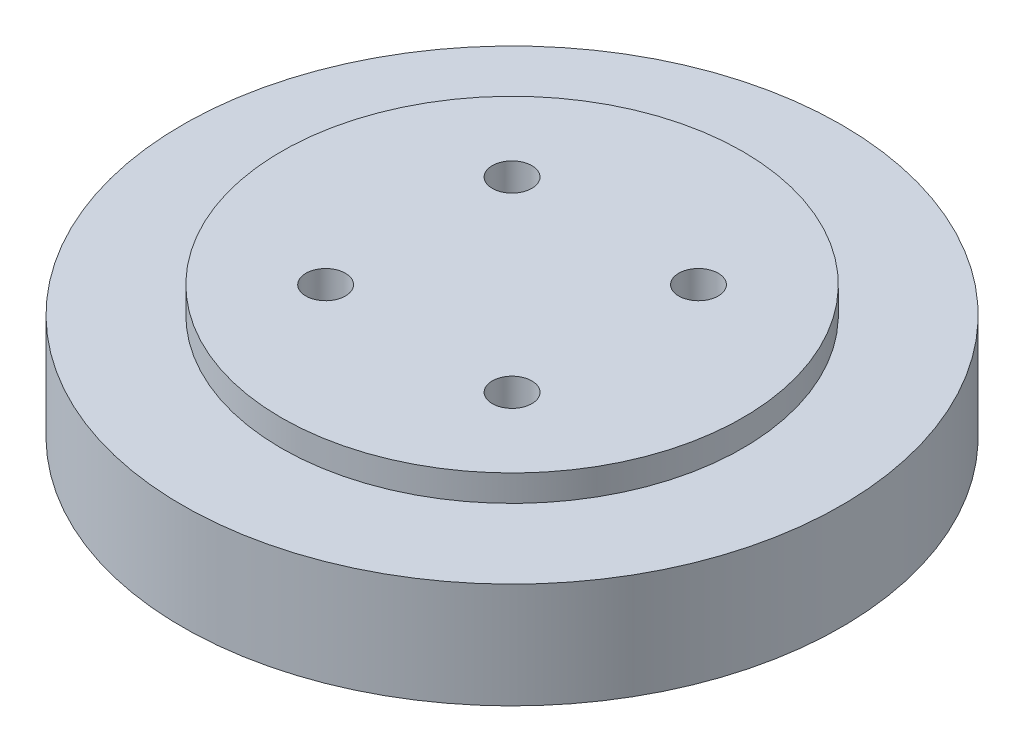
ISO-10303-21;
HEADER;
FILE_DESCRIPTION(('STEP AP214'),'2;1');
FILE_NAME('part.step','',(''),(''),'','','');
FILE_SCHEMA(('AUTOMOTIVE_DESIGN { 1 0 10303 214 1 1 1 1 }'));
ENDSEC;
DATA;
#1=APPLICATION_CONTEXT('core data for automotive mechanical design processes');
#2=APPLICATION_PROTOCOL_DEFINITION('international standard','automotive_design',2000,#1);
#3=PRODUCT_CONTEXT('',#1,'mechanical');
#4=PRODUCT('Part','Part','',(#3));
#5=PRODUCT_RELATED_PRODUCT_CATEGORY('part','',(#4));
#6=PRODUCT_DEFINITION_FORMATION('','',#4);
#7=PRODUCT_DEFINITION_CONTEXT('part definition',#1,'design');
#8=PRODUCT_DEFINITION('design','',#6,#7);
#9=PRODUCT_DEFINITION_SHAPE('','',#8);
#10=(LENGTH_UNIT() NAMED_UNIT(*) SI_UNIT(.MILLI.,.METRE.));
#11=(NAMED_UNIT(*) PLANE_ANGLE_UNIT() SI_UNIT($,.RADIAN.));
#12=(NAMED_UNIT(*) SI_UNIT($,.STERADIAN.) SOLID_ANGLE_UNIT());
#13=UNCERTAINTY_MEASURE_WITH_UNIT(LENGTH_MEASURE(1.E-05),#10,'distance_accuracy_value','');
#14=(GEOMETRIC_REPRESENTATION_CONTEXT(3) GLOBAL_UNCERTAINTY_ASSIGNED_CONTEXT((#13)) GLOBAL_UNIT_ASSIGNED_CONTEXT((#10,
#11,#12)) REPRESENTATION_CONTEXT('',''));
#15=CARTESIAN_POINT('',(0.,0.,0.));
#16=DIRECTION('',(0.,0.,1.));
#17=DIRECTION('',(1.,0.,0.));
#18=AXIS2_PLACEMENT_3D('',#15,#16,#17);
#19=CARTESIAN_POINT('',(0.,0.,0.));
#20=DIRECTION('',(0.,-1.,0.));
#21=DIRECTION('',(0.,0.,-1.));
#22=AXIS2_PLACEMENT_3D('',#19,#20,#21);
#23=CYLINDRICAL_SURFACE('',#22,7.);
#24=DIRECTION('',(0.,-1.,0.));
#25=VECTOR('',#24,1.);
#26=CARTESIAN_POINT('',(-5.36231110183288,10.149030895279,4.4995132678058));
#27=LINE('',#26,#25);
#28=CARTESIAN_POINT('',(-5.36231110183284,6.99999999999998,4.4995132678058));
#29=VERTEX_POINT('',#28);
#30=CARTESIAN_POINT('',(-5.36231110183283,0.,4.4995132678058));
#31=VERTEX_POINT('',#30);
#32=EDGE_CURVE('E349',#29,#31,#27,.T.);
#33=ORIENTED_EDGE('',*,*,#32,.T.);
#34=CARTESIAN_POINT('',(0.,0.,0.));
#35=DIRECTION('',(0.,-1.,0.));
#36=DIRECTION('',(0.,0.,-1.));
#37=AXIS2_PLACEMENT_3D('',#34,#35,#36);
#38=CIRCLE('',#37,7.);
#39=CARTESIAN_POINT('',(-1.21553724366839,0.,6.89365427108546));
#40=VERTEX_POINT('',#39);
#41=EDGE_CURVE('E11',#40,#31,#38,.T.);
#42=ORIENTED_EDGE('',*,*,#41,.F.);
#43=DIRECTION('',(0.,-1.,0.));
#44=VECTOR('',#43,1.);
#45=CARTESIAN_POINT('',(-1.21553724366841,9.66472120194616,6.89365427108546));
#46=LINE('',#45,#44);
#47=CARTESIAN_POINT('',(-1.21553724366841,6.99999999999998,6.89365427108546));
#48=VERTEX_POINT('',#47);
#49=EDGE_CURVE('E298',#48,#40,#46,.T.);
#50=ORIENTED_EDGE('',*,*,#49,.F.);
#51=CARTESIAN_POINT('',(0.,7.00000000000001,0.));
#52=DIRECTION('',(0.,-1.,0.));
#53=DIRECTION('',(0.,0.,-1.));
#54=AXIS2_PLACEMENT_3D('',#51,#52,#53);
#55=CIRCLE('',#54,7.);
#56=EDGE_CURVE('E229',#48,#29,#55,.T.);
#57=ORIENTED_EDGE('',*,*,#56,.T.);
#58=EDGE_LOOP('',(#33,#42,#50,#57));
#59=FACE_BOUND('',#58,.T.);
#60=ADVANCED_FACE('F38',(#59),#23,.T.);
#61=DIRECTION('',(0.,-1.,0.));
#62=VECTOR('',#61,1.);
#63=CARTESIAN_POINT('',(-6.57784834550138,10.149030895279,2.39414100327981));
#64=LINE('',#63,#62);
#65=CARTESIAN_POINT('',(-6.57784834550134,7.00000000000001,2.39414100327981));
#66=VERTEX_POINT('',#65);
#67=CARTESIAN_POINT('',(-6.57784834550133,0.,2.39414100327981));
#68=VERTEX_POINT('',#67);
#69=EDGE_CURVE('E342',#66,#68,#64,.T.);
#70=ORIENTED_EDGE('',*,*,#69,.F.);
#71=CARTESIAN_POINT('',(-6.57784834550131,7.00000000000001,-2.39414100327967));
#72=VERTEX_POINT('',#71);
#73=EDGE_CURVE('E235',#66,#72,#55,.T.);
#74=ORIENTED_EDGE('',*,*,#73,.T.);
#75=DIRECTION('',(0.,-1.,0.));
#76=VECTOR('',#75,1.);
#77=CARTESIAN_POINT('',(-6.57784834550136,10.149030895279,-2.39414100327967));
#78=LINE('',#77,#76);
#79=CARTESIAN_POINT('',(-6.57784834550129,0.,-2.39414100327967));
#80=VERTEX_POINT('',#79);
#81=EDGE_CURVE('E372',#72,#80,#78,.T.);
#82=ORIENTED_EDGE('',*,*,#81,.T.);
#83=EDGE_CURVE('E46',#68,#80,#38,.T.);
#84=ORIENTED_EDGE('',*,*,#83,.F.);
#85=EDGE_LOOP('',(#70,#74,#82,#84));
#86=FACE_BOUND('',#85,.T.);
#87=ADVANCED_FACE('F462',(#86),#23,.T.);
#88=DIRECTION('',(0.,-1.,0.));
#89=VECTOR('',#88,1.);
#90=CARTESIAN_POINT('',(-5.36231110183292,10.1490308952789,-4.49951326780569));
#91=LINE('',#90,#89);
#92=CARTESIAN_POINT('',(-5.36231110183286,6.99999999999998,-4.49951326780569));
#93=VERTEX_POINT('',#92);
#94=CARTESIAN_POINT('',(-5.3623111018329,0.,-4.49951326780569));
#95=VERTEX_POINT('',#94);
#96=EDGE_CURVE('E365',#93,#95,#91,.T.);
#97=ORIENTED_EDGE('',*,*,#96,.F.);
#98=CARTESIAN_POINT('',(-1.21553724366848,6.99999999999998,-6.89365427108547));
#99=VERTEX_POINT('',#98);
#100=EDGE_CURVE('E242',#93,#99,#55,.T.);
#101=ORIENTED_EDGE('',*,*,#100,.T.);
#102=DIRECTION('',(0.,-1.,0.));
#103=VECTOR('',#102,1.);
#104=CARTESIAN_POINT('',(-1.21553724366848,9.66472120194616,-6.89365427108546));
#105=LINE('',#104,#103);
#106=CARTESIAN_POINT('',(-1.21553724366846,0.,-6.89365427108546));
#107=VERTEX_POINT('',#106);
#108=EDGE_CURVE('E393',#99,#107,#105,.T.);
#109=ORIENTED_EDGE('',*,*,#108,.T.);
#110=EDGE_CURVE('E228',#95,#107,#38,.T.);
#111=ORIENTED_EDGE('',*,*,#110,.F.);
#112=EDGE_LOOP('',(#97,#101,#109,#111));
#113=FACE_BOUND('',#112,.T.);
#114=ADVANCED_FACE('F471',(#113),#23,.T.);
#115=DIRECTION('',(0.,-1.,0.));
#116=VECTOR('',#115,1.);
#117=CARTESIAN_POINT('',(1.21553724366846,9.66472120194617,-6.89365427108546));
#118=LINE('',#117,#116);
#119=CARTESIAN_POINT('',(1.21553724366845,7.00000000000001,-6.89365427108546));
#120=VERTEX_POINT('',#119);
#121=CARTESIAN_POINT('',(1.21553724366846,0.,-6.89365427108546));
#122=VERTEX_POINT('',#121);
#123=EDGE_CURVE('E386',#120,#122,#118,.T.);
#124=ORIENTED_EDGE('',*,*,#123,.F.);
#125=CARTESIAN_POINT('',(5.3623111018329,7.00000000000001,-4.49951326780576));
#126=VERTEX_POINT('',#125);
#127=EDGE_CURVE('E251',#120,#126,#55,.T.);
#128=ORIENTED_EDGE('',*,*,#127,.T.);
#129=DIRECTION('',(0.,-1.,0.));
#130=VECTOR('',#129,1.);
#131=CARTESIAN_POINT('',(5.36231110183286,10.149030895279,-4.49951326780576));
#132=LINE('',#131,#130);
#133=CARTESIAN_POINT('',(5.36231110183286,0.,-4.49951326780576));
#134=VERTEX_POINT('',#133);
#135=EDGE_CURVE('E62',#126,#134,#132,.T.);
#136=ORIENTED_EDGE('',*,*,#135,.T.);
#137=EDGE_CURVE('E226',#122,#134,#38,.T.);
#138=ORIENTED_EDGE('',*,*,#137,.F.);
#139=EDGE_LOOP('',(#124,#128,#136,#138));
#140=FACE_BOUND('',#139,.T.);
#141=ADVANCED_FACE('F490',(#140),#23,.T.);
#142=DIRECTION('',(0.,-1.,0.));
#143=VECTOR('',#142,1.);
#144=CARTESIAN_POINT('',(6.57784834550133,10.149030895279,-2.39414100327975));
#145=LINE('',#144,#143);
#146=CARTESIAN_POINT('',(6.57784834550138,6.99999999999998,-2.39414100327975));
#147=VERTEX_POINT('',#146);
#148=CARTESIAN_POINT('',(6.57784834550135,0.,-2.39414100327975));
#149=VERTEX_POINT('',#148);
#150=EDGE_CURVE('E200',#147,#149,#145,.T.);
#151=ORIENTED_EDGE('',*,*,#150,.F.);
#152=CARTESIAN_POINT('',(6.5778483455014,6.99999999999998,2.39414100327971));
#153=VERTEX_POINT('',#152);
#154=EDGE_CURVE('E244',#147,#153,#55,.T.);
#155=ORIENTED_EDGE('',*,*,#154,.T.);
#156=DIRECTION('',(0.,-1.,0.));
#157=VECTOR('',#156,1.);
#158=CARTESIAN_POINT('',(6.57784834550135,10.1490308952789,2.39414100327971));
#159=LINE('',#158,#157);
#160=CARTESIAN_POINT('',(6.57784834550135,0.,2.39414100327971));
#161=VERTEX_POINT('',#160);
#162=EDGE_CURVE('E54',#153,#161,#159,.T.);
#163=ORIENTED_EDGE('',*,*,#162,.T.);
#164=EDGE_CURVE('E219',#149,#161,#38,.T.);
#165=ORIENTED_EDGE('',*,*,#164,.F.);
#166=EDGE_LOOP('',(#151,#155,#163,#165));
#167=FACE_BOUND('',#166,.T.);
#168=ADVANCED_FACE('F225',(#167),#23,.T.);
#169=CARTESIAN_POINT('',(0.,0.,0.));
#170=DIRECTION('',(0.,-1.,0.));
#171=DIRECTION('',(0.,0.,-1.));
#172=AXIS2_PLACEMENT_3D('',#169,#170,#171);
#173=PLANE('',#172);
#174=DIRECTION('',(-0.766044443118975,0.,0.642787609686543));
#175=VECTOR('',#174,1.);
#176=CARTESIAN_POINT('',(-5.36231110183283,0.,4.4995132678058));
#177=LINE('',#176,#175);
#178=CARTESIAN_POINT('',(-4.59626665871385,0.,3.85672565811925));
#179=VERTEX_POINT('',#178);
#180=EDGE_CURVE('E345',#179,#31,#177,.T.);
#181=ORIENTED_EDGE('',*,*,#180,.F.);
#182=CARTESIAN_POINT('',(0.,0.,0.));
#183=DIRECTION('',(0.,1.,0.));
#184=DIRECTION('',(0.866025403784433,0.,-0.50000000000001));
#185=AXIS2_PLACEMENT_3D('',#182,#183,#184);
#186=CIRCLE('',#185,6.);
#187=CARTESIAN_POINT('',(-5.63815572471542,0.,2.05212085995409));
#188=VERTEX_POINT('',#187);
#189=EDGE_CURVE('E353',#188,#179,#186,.T.);
#190=ORIENTED_EDGE('',*,*,#189,.F.);
#191=DIRECTION('',(0.939692620785902,0.,-0.342020143325686));
#192=VECTOR('',#191,1.);
#193=CARTESIAN_POINT('',(-6.57784834550133,0.,2.39414100327981));
#194=LINE('',#193,#192);
#195=EDGE_CURVE('E356',#68,#188,#194,.T.);
#196=ORIENTED_EDGE('',*,*,#195,.F.);
#197=ORIENTED_EDGE('',*,*,#83,.T.);
#198=DIRECTION('',(-0.939692620785909,0.,-0.342020143325667));
#199=VECTOR('',#198,1.);
#200=CARTESIAN_POINT('',(-6.57784834550129,0.,-2.39414100327967));
#201=LINE('',#200,#199);
#202=CARTESIAN_POINT('',(-5.63815572471547,0.,-2.052120859954));
#203=VERTEX_POINT('',#202);
#204=EDGE_CURVE('E368',#203,#80,#201,.T.);
#205=ORIENTED_EDGE('',*,*,#204,.F.);
#206=CARTESIAN_POINT('',(0.,0.,0.));
#207=DIRECTION('',(0.,1.,0.));
#208=DIRECTION('',(0.866025403784443,0.,0.499999999999992));
#209=AXIS2_PLACEMENT_3D('',#206,#207,#208);
#210=CIRCLE('',#209,6.);
#211=CARTESIAN_POINT('',(-4.59626665871393,0.,-3.85672565811916));
#212=VERTEX_POINT('',#211);
#213=EDGE_CURVE('E377',#212,#203,#210,.T.);
#214=ORIENTED_EDGE('',*,*,#213,.F.);
#215=DIRECTION('',(0.766044443118989,0.,0.642787609686527));
#216=VECTOR('',#215,1.);
#217=CARTESIAN_POINT('',(-5.3623111018329,0.,-4.49951326780569));
#218=LINE('',#217,#216);
#219=EDGE_CURVE('E340',#95,#212,#218,.T.);
#220=ORIENTED_EDGE('',*,*,#219,.F.);
#221=ORIENTED_EDGE('',*,*,#110,.T.);
#222=DIRECTION('',(-0.173648177666923,0.,-0.984807753012209));
#223=VECTOR('',#222,1.);
#224=CARTESIAN_POINT('',(-1.21553724366846,0.,-6.89365427108546));
#225=LINE('',#224,#223);
#226=CARTESIAN_POINT('',(-1.04188906600156,0.,-5.90884651807326));
#227=VERTEX_POINT('',#226);
#228=EDGE_CURVE('E389',#227,#107,#225,.T.);
#229=ORIENTED_EDGE('',*,*,#228,.F.);
#230=CARTESIAN_POINT('',(0.,0.,0.));
#231=DIRECTION('',(0.,1.,0.));
#232=DIRECTION('',(0.,0.,1.));
#233=AXIS2_PLACEMENT_3D('',#230,#231,#232);
#234=CIRCLE('',#233,6.);
#235=CARTESIAN_POINT('',(1.04188906600152,0.,-5.90884651807326));
#236=VERTEX_POINT('',#235);
#237=EDGE_CURVE('E398',#236,#227,#234,.T.);
#238=ORIENTED_EDGE('',*,*,#237,.F.);
#239=DIRECTION('',(-0.173648177666923,0.,0.984807753012209));
#240=VECTOR('',#239,1.);
#241=CARTESIAN_POINT('',(1.21553724366846,0.,-6.89365427108546));
#242=LINE('',#241,#240);
#243=EDGE_CURVE('E363',#122,#236,#242,.T.);
#244=ORIENTED_EDGE('',*,*,#243,.F.);
#245=ORIENTED_EDGE('',*,*,#137,.T.);
#246=DIRECTION('',(0.76604444311898,0.,-0.642787609686538));
#247=VECTOR('',#246,1.);
#248=CARTESIAN_POINT('',(5.36231110183286,0.,-4.49951326780576));
#249=LINE('',#248,#247);
#250=CARTESIAN_POINT('',(4.59626665871387,0.,-3.85672565811923));
#251=VERTEX_POINT('',#250);
#252=EDGE_CURVE('E213',#251,#134,#249,.T.);
#253=ORIENTED_EDGE('',*,*,#252,.F.);
#254=CARTESIAN_POINT('',(0.,0.,0.));
#255=DIRECTION('',(0.,1.,0.));
#256=DIRECTION('',(-0.866025403784436,0.,0.500000000000004));
#257=AXIS2_PLACEMENT_3D('',#254,#255,#256);
#258=CIRCLE('',#257,6.);
#259=CARTESIAN_POINT('',(5.63815572471543,0.,-2.05212085995407));
#260=VERTEX_POINT('',#259);
#261=EDGE_CURVE('E222',#260,#251,#258,.T.);
#262=ORIENTED_EDGE('',*,*,#261,.F.);
#263=DIRECTION('',(-0.939692620785905,0.,0.34202014332568));
#264=VECTOR('',#263,1.);
#265=CARTESIAN_POINT('',(6.57784834550135,0.,-2.39414100327975));
#266=LINE('',#265,#264);
#267=EDGE_CURVE('E204',#149,#260,#266,.T.);
#268=ORIENTED_EDGE('',*,*,#267,.F.);
#269=ORIENTED_EDGE('',*,*,#164,.T.);
#270=DIRECTION('',(0.939692620785907,0.,0.342020143325673));
#271=VECTOR('',#270,1.);
#272=CARTESIAN_POINT('',(6.57784834550135,0.,2.39414100327971));
#273=LINE('',#272,#271);
#274=CARTESIAN_POINT('',(5.63815572471547,0.,2.05212085995404));
#275=VERTEX_POINT('',#274);
#276=EDGE_CURVE('E323',#275,#161,#273,.T.);
#277=ORIENTED_EDGE('',*,*,#276,.F.);
#278=CARTESIAN_POINT('',(0.,0.,0.));
#279=DIRECTION('',(0.,1.,0.));
#280=DIRECTION('',(-0.86602540378444,0.,-0.499999999999998));
#281=AXIS2_PLACEMENT_3D('',#278,#279,#280);
#282=CIRCLE('',#281,6.);
#283=CARTESIAN_POINT('',(4.5962666587139,0.,3.85672565811917));
#284=VERTEX_POINT('',#283);
#285=EDGE_CURVE('E330',#284,#275,#282,.T.);
#286=ORIENTED_EDGE('',*,*,#285,.F.);
#287=DIRECTION('',(-0.766044443118984,0.,-0.642787609686532));
#288=VECTOR('',#287,1.);
#289=CARTESIAN_POINT('',(5.36231110183288,0.,4.49951326780573));
#290=LINE('',#289,#288);
#291=CARTESIAN_POINT('',(5.36231110183288,0.,4.49951326780573));
#292=VERTEX_POINT('',#291);
#293=EDGE_CURVE('E333',#292,#284,#290,.T.);
#294=ORIENTED_EDGE('',*,*,#293,.F.);
#295=CARTESIAN_POINT('',(1.21553724366853,0.,6.89365427108546));
#296=VERTEX_POINT('',#295);
#297=EDGE_CURVE('E47',#292,#296,#38,.T.);
#298=ORIENTED_EDGE('',*,*,#297,.T.);
#299=DIRECTION('',(0.173648177666923,0.,0.984807753012209));
#300=VECTOR('',#299,1.);
#301=CARTESIAN_POINT('',(1.21553724366853,0.,6.89365427108546));
#302=LINE('',#301,#300);
#303=CARTESIAN_POINT('',(1.04188906600154,0.,5.90884651807326));
#304=VERTEX_POINT('',#303);
#305=EDGE_CURVE('E301',#304,#296,#302,.T.);
#306=ORIENTED_EDGE('',*,*,#305,.F.);
#307=CARTESIAN_POINT('',(0.,0.,0.));
#308=DIRECTION('',(0.,1.,0.));
#309=DIRECTION('',(0.,0.,-1.));
#310=AXIS2_PLACEMENT_3D('',#307,#308,#309);
#311=CIRCLE('',#310,6.);
#312=CARTESIAN_POINT('',(-1.04188906600154,0.,5.90884651807326));
#313=VERTEX_POINT('',#312);
#314=EDGE_CURVE('E309',#313,#304,#311,.T.);
#315=ORIENTED_EDGE('',*,*,#314,.F.);
#316=DIRECTION('',(0.173648177666923,0.,-0.984807753012209));
#317=VECTOR('',#316,1.);
#318=CARTESIAN_POINT('',(-1.21553724366839,0.,6.89365427108546));
#319=LINE('',#318,#317);
#320=EDGE_CURVE('E312',#40,#313,#319,.T.);
#321=ORIENTED_EDGE('',*,*,#320,.F.);
#322=ORIENTED_EDGE('',*,*,#41,.T.);
#323=EDGE_LOOP('',(#181,#190,#196,#197,#205,#214,#220,#221,#229,#238,#244,#245,#253,#262,#268,
#269,#277,#286,#294,#298,#306,#315,#321,#322));
#324=FACE_BOUND('',#323,.T.);
#325=ADVANCED_FACE('F40',(#324),#173,.T.);
#326=DIRECTION('',(0.,-1.,0.));
#327=VECTOR('',#326,1.);
#328=CARTESIAN_POINT('',(5.36231110183282,10.149030895279,4.49951326780573));
#329=LINE('',#328,#327);
#330=CARTESIAN_POINT('',(5.36231110183288,7.00000000000001,4.49951326780573));
#331=VERTEX_POINT('',#330);
#332=EDGE_CURVE('E320',#331,#292,#329,.T.);
#333=ORIENTED_EDGE('',*,*,#332,.F.);
#334=CARTESIAN_POINT('',(1.21553724366853,7.00000000000001,6.89365427108546));
#335=VERTEX_POINT('',#334);
#336=EDGE_CURVE('E236',#331,#335,#55,.T.);
#337=ORIENTED_EDGE('',*,*,#336,.T.);
#338=DIRECTION('',(0.,-1.,0.));
#339=VECTOR('',#338,1.);
#340=CARTESIAN_POINT('',(1.21553724366853,9.66472120194617,6.89365427108546));
#341=LINE('',#340,#339);
#342=EDGE_CURVE('E305',#335,#296,#341,.T.);
#343=ORIENTED_EDGE('',*,*,#342,.T.);
#344=ORIENTED_EDGE('',*,*,#297,.F.);
#345=EDGE_LOOP('',(#333,#337,#343,#344));
#346=FACE_BOUND('',#345,.T.);
#347=ADVANCED_FACE('F430',(#346),#23,.T.);
#348=CARTESIAN_POINT('',(6.99999999999999,7.,0.));
#349=DIRECTION('',(0.,-1.,0.));
#350=DIRECTION('',(0.,0.,-1.));
#351=AXIS2_PLACEMENT_3D('',#348,#349,#350);
#352=PLANE('',#351);
#353=CARTESIAN_POINT('',(-7.07106781186542,7.00000000000001,7.07106781186555));
#354=DIRECTION('',(0.,-1.,0.));
#355=DIRECTION('',(0.,0.,-1.));
#356=AXIS2_PLACEMENT_3D('',#353,#354,#355);
#357=CIRCLE('',#356,1.5);
#358=CARTESIAN_POINT('',(-7.07106781186542,7.00000000000001,5.57106781186555));
#359=VERTEX_POINT('',#358);
#360=EDGE_CURVE('E277',#359,#359,#357,.T.);
#361=ORIENTED_EDGE('',*,*,#360,.F.);
#362=EDGE_LOOP('',(#361));
#363=FACE_BOUND('',#362,.T.);
#364=CARTESIAN_POINT('',(7.0710678118655,7.,7.07106781186544));
#365=DIRECTION('',(0.,-1.,0.));
#366=DIRECTION('',(0.,0.,-1.));
#367=AXIS2_PLACEMENT_3D('',#364,#365,#366);
#368=CIRCLE('',#367,1.5);
#369=CARTESIAN_POINT('',(7.0710678118655,7.,5.57106781186544));
#370=VERTEX_POINT('',#369);
#371=EDGE_CURVE('E280',#370,#370,#368,.T.);
#372=ORIENTED_EDGE('',*,*,#371,.F.);
#373=EDGE_LOOP('',(#372));
#374=FACE_BOUND('',#373,.T.);
#375=CARTESIAN_POINT('',(7.07106781186535,7.,-7.07106781186559));
#376=DIRECTION('',(0.,-1.,0.));
#377=DIRECTION('',(0.,0.,-1.));
#378=AXIS2_PLACEMENT_3D('',#375,#376,#377);
#379=CIRCLE('',#378,1.5);
#380=CARTESIAN_POINT('',(7.07106781186535,7.,-8.57106781186559));
#381=VERTEX_POINT('',#380);
#382=EDGE_CURVE('E283',#381,#381,#379,.T.);
#383=ORIENTED_EDGE('',*,*,#382,.F.);
#384=EDGE_LOOP('',(#383));
#385=FACE_BOUND('',#384,.T.);
#386=CARTESIAN_POINT('',(-7.07106781186553,7.00000000000001,-7.07106781186544));
#387=DIRECTION('',(0.,-1.,0.));
#388=DIRECTION('',(0.,0.,-1.));
#389=AXIS2_PLACEMENT_3D('',#386,#387,#388);
#390=CIRCLE('',#389,1.5);
#391=CARTESIAN_POINT('',(-7.07106781186553,7.00000000000001,-8.57106781186544));
#392=VERTEX_POINT('',#391);
#393=EDGE_CURVE('E271',#392,#392,#390,.T.);
#394=ORIENTED_EDGE('',*,*,#393,.F.);
#395=EDGE_LOOP('',(#394));
#396=FACE_BOUND('',#395,.T.);
#397=CARTESIAN_POINT('',(0.,7.00000000000001,0.));
#398=DIRECTION('',(0.,-1.,0.));
#399=DIRECTION('',(0.,0.,-1.));
#400=AXIS2_PLACEMENT_3D('',#397,#398,#399);
#401=CIRCLE('',#400,24.);
#402=CARTESIAN_POINT('',(0.,7.00000000000001,-24.));
#403=VERTEX_POINT('',#402);
#404=EDGE_CURVE('E245',#403,#403,#401,.T.);
#405=ORIENTED_EDGE('',*,*,#404,.T.);
#406=EDGE_LOOP('',(#405));
#407=FACE_BOUND('',#406,.T.);
#408=ORIENTED_EDGE('',*,*,#56,.F.);
#409=DIRECTION('',(-0.173648177666923,0.,0.984807753012209));
#410=VECTOR('',#409,1.);
#411=CARTESIAN_POINT('',(-1.21553724366841,6.99999999999998,6.89365427108546));
#412=LINE('',#411,#410);
#413=CARTESIAN_POINT('',(-1.04188906600156,7.,5.90884651807326));
#414=VERTEX_POINT('',#413);
#415=EDGE_CURVE('E291',#414,#48,#412,.T.);
#416=ORIENTED_EDGE('',*,*,#415,.F.);
#417=CARTESIAN_POINT('',(0.,7.00000000000001,0.));
#418=DIRECTION('',(0.,-1.,0.));
#419=DIRECTION('',(0.,0.,-1.));
#420=AXIS2_PLACEMENT_3D('',#417,#418,#419);
#421=CIRCLE('',#420,6.);
#422=CARTESIAN_POINT('',(1.04188906600153,7.00000000000001,5.90884651807326));
#423=VERTEX_POINT('',#422);
#424=EDGE_CURVE('E307',#423,#414,#421,.T.);
#425=ORIENTED_EDGE('',*,*,#424,.F.);
#426=DIRECTION('',(-0.173648177666923,0.,-0.984807753012209));
#427=VECTOR('',#426,1.);
#428=CARTESIAN_POINT('',(1.21553724366852,7.00000000000001,6.89365427108546));
#429=LINE('',#428,#427);
#430=EDGE_CURVE('E297',#335,#423,#429,.T.);
#431=ORIENTED_EDGE('',*,*,#430,.F.);
#432=ORIENTED_EDGE('',*,*,#336,.F.);
#433=DIRECTION('',(0.766044443118984,0.,0.642787609686532));
#434=VECTOR('',#433,1.);
#435=CARTESIAN_POINT('',(5.36231110183288,7.00000000000001,4.49951326780573));
#436=LINE('',#435,#434);
#437=CARTESIAN_POINT('',(4.59626665871388,6.99999999999998,3.85672565811919));
#438=VERTEX_POINT('',#437);
#439=EDGE_CURVE('E315',#438,#331,#436,.T.);
#440=ORIENTED_EDGE('',*,*,#439,.F.);
#441=CARTESIAN_POINT('',(0.,7.00000000000001,0.));
#442=DIRECTION('',(0.,-1.,0.));
#443=DIRECTION('',(0.,0.,-1.));
#444=AXIS2_PLACEMENT_3D('',#441,#442,#443);
#445=CIRCLE('',#444,6.);
#446=CARTESIAN_POINT('',(5.63815572471549,7.00000000000001,2.05212085995404));
#447=VERTEX_POINT('',#446);
#448=EDGE_CURVE('E328',#447,#438,#445,.T.);
#449=ORIENTED_EDGE('',*,*,#448,.F.);
#450=DIRECTION('',(-0.939692620785907,0.,-0.342020143325673));
#451=VECTOR('',#450,1.);
#452=CARTESIAN_POINT('',(6.5778483455014,6.99999999999998,2.39414100327971));
#453=LINE('',#452,#451);
#454=EDGE_CURVE('E319',#153,#447,#453,.T.);
#455=ORIENTED_EDGE('',*,*,#454,.F.);
#456=ORIENTED_EDGE('',*,*,#154,.F.);
#457=DIRECTION('',(0.939692620785904,0.,-0.34202014332568));
#458=VECTOR('',#457,1.);
#459=CARTESIAN_POINT('',(6.57784834550138,6.99999999999998,-2.39414100327975));
#460=LINE('',#459,#458);
#461=CARTESIAN_POINT('',(5.63815572471541,7.00000000000001,-2.05212085995407));
#462=VERTEX_POINT('',#461);
#463=EDGE_CURVE('E207',#462,#147,#460,.T.);
#464=ORIENTED_EDGE('',*,*,#463,.F.);
#465=CARTESIAN_POINT('',(0.,7.00000000000001,0.));
#466=DIRECTION('',(0.,-1.,0.));
#467=DIRECTION('',(0.,0.,-1.));
#468=AXIS2_PLACEMENT_3D('',#465,#466,#467);
#469=CIRCLE('',#468,6.);
#470=CARTESIAN_POINT('',(4.59626665871386,6.99999999999998,-3.85672565811923));
#471=VERTEX_POINT('',#470);
#472=EDGE_CURVE('E411',#471,#462,#469,.T.);
#473=ORIENTED_EDGE('',*,*,#472,.F.);
#474=DIRECTION('',(-0.76604444311898,0.,0.642787609686537));
#475=VECTOR('',#474,1.);
#476=CARTESIAN_POINT('',(5.3623111018329,7.00000000000001,-4.49951326780576));
#477=LINE('',#476,#475);
#478=EDGE_CURVE('E405',#126,#471,#477,.T.);
#479=ORIENTED_EDGE('',*,*,#478,.F.);
#480=ORIENTED_EDGE('',*,*,#127,.F.);
#481=DIRECTION('',(0.173648177666923,0.,-0.984807753012209));
#482=VECTOR('',#481,1.);
#483=CARTESIAN_POINT('',(1.21553724366845,7.00000000000001,-6.89365427108546));
#484=LINE('',#483,#482);
#485=CARTESIAN_POINT('',(1.04188906600152,7.00000000000001,-5.90884651807326));
#486=VERTEX_POINT('',#485);
#487=EDGE_CURVE('E223',#486,#120,#484,.T.);
#488=ORIENTED_EDGE('',*,*,#487,.F.);
#489=CARTESIAN_POINT('',(0.,7.00000000000001,0.));
#490=DIRECTION('',(0.,-1.,0.));
#491=DIRECTION('',(0.,0.,-1.));
#492=AXIS2_PLACEMENT_3D('',#489,#490,#491);
#493=CIRCLE('',#492,6.);
#494=CARTESIAN_POINT('',(-1.04188906600156,7.,-5.90884651807326));
#495=VERTEX_POINT('',#494);
#496=EDGE_CURVE('E396',#495,#486,#493,.T.);
#497=ORIENTED_EDGE('',*,*,#496,.F.);
#498=DIRECTION('',(0.173648177666923,0.,0.984807753012209));
#499=VECTOR('',#498,1.);
#500=CARTESIAN_POINT('',(-1.21553724366848,6.99999999999998,-6.89365427108546));
#501=LINE('',#500,#499);
#502=EDGE_CURVE('E385',#99,#495,#501,.T.);
#503=ORIENTED_EDGE('',*,*,#502,.F.);
#504=ORIENTED_EDGE('',*,*,#100,.F.);
#505=DIRECTION('',(-0.766044443118989,0.,-0.642787609686527));
#506=VECTOR('',#505,1.);
#507=CARTESIAN_POINT('',(-5.36231110183286,6.99999999999998,-4.49951326780569));
#508=LINE('',#507,#506);
#509=CARTESIAN_POINT('',(-4.59626665871395,7.00000000000001,-3.85672565811916));
#510=VERTEX_POINT('',#509);
#511=EDGE_CURVE('E361',#510,#93,#508,.T.);
#512=ORIENTED_EDGE('',*,*,#511,.F.);
#513=CARTESIAN_POINT('',(0.,7.00000000000001,0.));
#514=DIRECTION('',(0.,-1.,0.));
#515=DIRECTION('',(0.,0.,-1.));
#516=AXIS2_PLACEMENT_3D('',#513,#514,#515);
#517=CIRCLE('',#516,6.);
#518=CARTESIAN_POINT('',(-5.63815572471548,7.00000000000001,-2.052120859954));
#519=VERTEX_POINT('',#518);
#520=EDGE_CURVE('E375',#519,#510,#517,.T.);
#521=ORIENTED_EDGE('',*,*,#520,.F.);
#522=DIRECTION('',(0.939692620785909,0.,0.342020143325667));
#523=VECTOR('',#522,1.);
#524=CARTESIAN_POINT('',(-6.57784834550131,7.00000000000001,-2.39414100327967));
#525=LINE('',#524,#523);
#526=EDGE_CURVE('E364',#72,#519,#525,.T.);
#527=ORIENTED_EDGE('',*,*,#526,.F.);
#528=ORIENTED_EDGE('',*,*,#73,.F.);
#529=DIRECTION('',(-0.939692620785902,0.,0.342020143325686));
#530=VECTOR('',#529,1.);
#531=CARTESIAN_POINT('',(-6.57784834550134,7.00000000000001,2.39414100327981));
#532=LINE('',#531,#530);
#533=CARTESIAN_POINT('',(-5.63815572471542,7.00000000000001,2.05212085995411));
#534=VERTEX_POINT('',#533);
#535=EDGE_CURVE('E338',#534,#66,#532,.T.);
#536=ORIENTED_EDGE('',*,*,#535,.F.);
#537=CARTESIAN_POINT('',(0.,7.00000000000001,0.));
#538=DIRECTION('',(0.,-1.,0.));
#539=DIRECTION('',(0.,0.,-1.));
#540=AXIS2_PLACEMENT_3D('',#537,#538,#539);
#541=CIRCLE('',#540,6.);
#542=CARTESIAN_POINT('',(-4.59626665871386,7.00000000000001,3.85672565811926));
#543=VERTEX_POINT('',#542);
#544=EDGE_CURVE('E351',#543,#534,#541,.T.);
#545=ORIENTED_EDGE('',*,*,#544,.F.);
#546=DIRECTION('',(0.766044443118975,0.,-0.642787609686543));
#547=VECTOR('',#546,1.);
#548=CARTESIAN_POINT('',(-5.36231110183284,6.99999999999998,4.4995132678058));
#549=LINE('',#548,#547);
#550=EDGE_CURVE('E341',#29,#543,#549,.T.);
#551=ORIENTED_EDGE('',*,*,#550,.F.);
#552=EDGE_LOOP('',(#408,#416,#425,#431,#432,#440,#449,#455,#456,#464,#473,#479,#480,#488,#497,
#503,#504,#512,#521,#527,#528,#536,#545,#551));
#553=FACE_BOUND('',#552,.T.);
#554=ADVANCED_FACE('F420',(#363,#374,#385,#396,#407,#553),#352,.T.);
#555=CARTESIAN_POINT('',(0.,0.,0.));
#556=DIRECTION('',(0.,-1.,0.));
#557=DIRECTION('',(0.,0.,-1.));
#558=AXIS2_PLACEMENT_3D('',#555,#556,#557);
#559=CYLINDRICAL_SURFACE('',#558,24.);
#560=CARTESIAN_POINT('',(0.,0.,0.));
#561=DIRECTION('',(0.,-1.,0.));
#562=DIRECTION('',(0.,0.,-1.));
#563=AXIS2_PLACEMENT_3D('',#560,#561,#562);
#564=CIRCLE('',#563,24.);
#565=CARTESIAN_POINT('',(0.,0.,-24.));
#566=VERTEX_POINT('',#565);
#567=EDGE_CURVE('E253',#566,#566,#564,.T.);
#568=ORIENTED_EDGE('',*,*,#567,.T.);
#569=EDGE_LOOP('',(#568));
#570=FACE_BOUND('',#569,.T.);
#571=ORIENTED_EDGE('',*,*,#404,.F.);
#572=EDGE_LOOP('',(#571));
#573=FACE_BOUND('',#572,.T.);
#574=ADVANCED_FACE('F512',(#570,#573),#559,.F.);
#575=CARTESIAN_POINT('',(24.,0.,0.));
#576=DIRECTION('',(0.,-1.,0.));
#577=DIRECTION('',(0.,0.,-1.));
#578=AXIS2_PLACEMENT_3D('',#575,#576,#577);
#579=PLANE('',#578);
#580=CARTESIAN_POINT('',(0.,0.,0.));
#581=DIRECTION('',(0.,-1.,0.));
#582=DIRECTION('',(0.,0.,-1.));
#583=AXIS2_PLACEMENT_3D('',#580,#581,#582);
#584=CIRCLE('',#583,25.);
#585=CARTESIAN_POINT('',(0.,0.,-25.));
#586=VERTEX_POINT('',#585);
#587=EDGE_CURVE('E257',#586,#586,#584,.T.);
#588=ORIENTED_EDGE('',*,*,#587,.T.);
#589=EDGE_LOOP('',(#588));
#590=FACE_BOUND('',#589,.T.);
#591=ORIENTED_EDGE('',*,*,#567,.F.);
#592=EDGE_LOOP('',(#591));
#593=FACE_BOUND('',#592,.T.);
#594=ADVANCED_FACE('F716',(#590,#593),#579,.T.);
#595=CARTESIAN_POINT('',(0.,0.,0.));
#596=DIRECTION('',(0.,-1.,0.));
#597=DIRECTION('',(0.,0.,-1.));
#598=AXIS2_PLACEMENT_3D('',#595,#596,#597);
#599=CYLINDRICAL_SURFACE('',#598,25.);
#600=CARTESIAN_POINT('',(0.,8.00000000000001,0.));
#601=DIRECTION('',(0.,-1.,0.));
#602=DIRECTION('',(0.,0.,-1.));
#603=AXIS2_PLACEMENT_3D('',#600,#601,#602);
#604=CIRCLE('',#603,25.);
#605=CARTESIAN_POINT('',(0.,8.00000000000001,-25.));
#606=VERTEX_POINT('',#605);
#607=EDGE_CURVE('E262',#606,#606,#604,.T.);
#608=ORIENTED_EDGE('',*,*,#607,.T.);
#609=EDGE_LOOP('',(#608));
#610=FACE_BOUND('',#609,.T.);
#611=ORIENTED_EDGE('',*,*,#587,.F.);
#612=EDGE_LOOP('',(#611));
#613=FACE_BOUND('',#612,.T.);
#614=ADVANCED_FACE('F712',(#610,#613),#599,.T.);
#615=CARTESIAN_POINT('',(25.,8.00000000000001,0.));
#616=DIRECTION('',(0.,1.,0.));
#617=DIRECTION('',(0.,0.,1.));
#618=AXIS2_PLACEMENT_3D('',#615,#616,#617);
#619=PLANE('',#618);
#620=CARTESIAN_POINT('',(0.,8.00000000000001,0.));
#621=DIRECTION('',(0.,-1.,0.));
#622=DIRECTION('',(0.,0.,-1.));
#623=AXIS2_PLACEMENT_3D('',#620,#621,#622);
#624=CIRCLE('',#623,17.5);
#625=CARTESIAN_POINT('',(0.,8.00000000000001,-17.5));
#626=VERTEX_POINT('',#625);
#627=EDGE_CURVE('E265',#626,#626,#624,.T.);
#628=ORIENTED_EDGE('',*,*,#627,.T.);
#629=EDGE_LOOP('',(#628));
#630=FACE_BOUND('',#629,.T.);
#631=ORIENTED_EDGE('',*,*,#607,.F.);
#632=EDGE_LOOP('',(#631));
#633=FACE_BOUND('',#632,.T.);
#634=ADVANCED_FACE('F708',(#630,#633),#619,.T.);
#635=CARTESIAN_POINT('',(0.,0.,0.));
#636=DIRECTION('',(0.,-1.,0.));
#637=DIRECTION('',(0.,0.,-1.));
#638=AXIS2_PLACEMENT_3D('',#635,#636,#637);
#639=CYLINDRICAL_SURFACE('',#638,17.5);
#640=CARTESIAN_POINT('',(0.,10.,0.));
#641=DIRECTION('',(0.,-1.,0.));
#642=DIRECTION('',(0.,0.,-1.));
#643=AXIS2_PLACEMENT_3D('',#640,#641,#642);
#644=CIRCLE('',#643,17.5);
#645=CARTESIAN_POINT('',(0.,10.,-17.5));
#646=VERTEX_POINT('',#645);
#647=EDGE_CURVE('E268',#646,#646,#644,.T.);
#648=ORIENTED_EDGE('',*,*,#647,.T.);
#649=EDGE_LOOP('',(#648));
#650=FACE_BOUND('',#649,.T.);
#651=ORIENTED_EDGE('',*,*,#627,.F.);
#652=EDGE_LOOP('',(#651));
#653=FACE_BOUND('',#652,.T.);
#654=ADVANCED_FACE('F704',(#650,#653),#639,.T.);
#655=CARTESIAN_POINT('',(17.5,10.,0.));
#656=DIRECTION('',(0.,1.,0.));
#657=DIRECTION('',(0.,0.,1.));
#658=AXIS2_PLACEMENT_3D('',#655,#656,#657);
#659=PLANE('',#658);
#660=CARTESIAN_POINT('',(-7.07106781186542,10.,7.07106781186555));
#661=DIRECTION('',(0.,1.,0.));
#662=DIRECTION('',(1.,0.,0.));
#663=AXIS2_PLACEMENT_3D('',#660,#661,#662);
#664=CIRCLE('',#663,1.5);
#665=CARTESIAN_POINT('',(-5.57106781186542,10.,7.07106781186555));
#666=VERTEX_POINT('',#665);
#667=EDGE_CURVE('E286',#666,#666,#664,.T.);
#668=ORIENTED_EDGE('',*,*,#667,.F.);
#669=EDGE_LOOP('',(#668));
#670=FACE_BOUND('',#669,.T.);
#671=CARTESIAN_POINT('',(7.07106781186544,10.,7.07106781186544));
#672=DIRECTION('',(0.,1.,0.));
#673=DIRECTION('',(0.,0.,-1.));
#674=AXIS2_PLACEMENT_3D('',#671,#672,#673);
#675=CIRCLE('',#674,1.5);
#676=CARTESIAN_POINT('',(7.07106781186544,10.,5.57106781186543));
#677=VERTEX_POINT('',#676);
#678=EDGE_CURVE('E290',#677,#677,#675,.T.);
#679=ORIENTED_EDGE('',*,*,#678,.F.);
#680=EDGE_LOOP('',(#679));
#681=FACE_BOUND('',#680,.T.);
#682=CARTESIAN_POINT('',(7.07106781186529,10.,-7.07106781186559));
#683=DIRECTION('',(0.,1.,0.));
#684=DIRECTION('',(-1.,0.,0.));
#685=AXIS2_PLACEMENT_3D('',#682,#683,#684);
#686=CIRCLE('',#685,1.5);
#687=CARTESIAN_POINT('',(5.57106781186529,10.,-7.07106781186557));
#688=VERTEX_POINT('',#687);
#689=EDGE_CURVE('E287',#688,#688,#686,.T.);
#690=ORIENTED_EDGE('',*,*,#689,.F.);
#691=EDGE_LOOP('',(#690));
#692=FACE_BOUND('',#691,.T.);
#693=CARTESIAN_POINT('',(-7.07106781186553,10.,-7.07106781186544));
#694=DIRECTION('',(0.,1.,0.));
#695=DIRECTION('',(0.,0.,1.));
#696=AXIS2_PLACEMENT_3D('',#693,#694,#695);
#697=CIRCLE('',#696,1.5);
#698=CARTESIAN_POINT('',(-7.07106781186553,10.,-5.57106781186543));
#699=VERTEX_POINT('',#698);
#700=EDGE_CURVE('E274',#699,#699,#697,.T.);
#701=ORIENTED_EDGE('',*,*,#700,.F.);
#702=EDGE_LOOP('',(#701));
#703=FACE_BOUND('',#702,.T.);
#704=ORIENTED_EDGE('',*,*,#647,.F.);
#705=EDGE_LOOP('',(#704));
#706=FACE_BOUND('',#705,.T.);
#707=ADVANCED_FACE('F700',(#670,#681,#692,#703,#706),#659,.T.);
#708=CARTESIAN_POINT('',(-7.07106781186552,0.,-7.07106781186544));
#709=DIRECTION('',(0.,1.,0.));
#710=DIRECTION('',(0.,0.,1.));
#711=AXIS2_PLACEMENT_3D('',#708,#709,#710);
#712=CYLINDRICAL_SURFACE('',#711,1.5);
#713=ORIENTED_EDGE('',*,*,#393,.T.);
#714=EDGE_LOOP('',(#713));
#715=FACE_BOUND('',#714,.T.);
#716=ORIENTED_EDGE('',*,*,#700,.T.);
#717=EDGE_LOOP('',(#716));
#718=FACE_BOUND('',#717,.T.);
#719=ADVANCED_FACE('F696',(#715,#718),#712,.F.);
#720=CARTESIAN_POINT('',(7.07106781186536,0.,-7.07106781186559));
#721=DIRECTION('',(0.,1.,0.));
#722=DIRECTION('',(0.,0.,1.));
#723=AXIS2_PLACEMENT_3D('',#720,#721,#722);
#724=CYLINDRICAL_SURFACE('',#723,1.5);
#725=ORIENTED_EDGE('',*,*,#382,.T.);
#726=EDGE_LOOP('',(#725));
#727=FACE_BOUND('',#726,.T.);
#728=ORIENTED_EDGE('',*,*,#689,.T.);
#729=EDGE_LOOP('',(#728));
#730=FACE_BOUND('',#729,.T.);
#731=ADVANCED_FACE('F692',(#727,#730),#724,.F.);
#732=CARTESIAN_POINT('',(7.0710678118655,0.,7.07106781186544));
#733=DIRECTION('',(0.,1.,0.));
#734=DIRECTION('',(0.,0.,1.));
#735=AXIS2_PLACEMENT_3D('',#732,#733,#734);
#736=CYLINDRICAL_SURFACE('',#735,1.5);
#737=ORIENTED_EDGE('',*,*,#371,.T.);
#738=EDGE_LOOP('',(#737));
#739=FACE_BOUND('',#738,.T.);
#740=ORIENTED_EDGE('',*,*,#678,.T.);
#741=EDGE_LOOP('',(#740));
#742=FACE_BOUND('',#741,.T.);
#743=ADVANCED_FACE('F688',(#739,#742),#736,.F.);
#744=CARTESIAN_POINT('',(-7.07106781186541,0.,7.07106781186555));
#745=DIRECTION('',(0.,1.,0.));
#746=DIRECTION('',(0.,0.,1.));
#747=AXIS2_PLACEMENT_3D('',#744,#745,#746);
#748=CYLINDRICAL_SURFACE('',#747,1.5);
#749=ORIENTED_EDGE('',*,*,#360,.T.);
#750=EDGE_LOOP('',(#749));
#751=FACE_BOUND('',#750,.T.);
#752=ORIENTED_EDGE('',*,*,#667,.T.);
#753=EDGE_LOOP('',(#752));
#754=FACE_BOUND('',#753,.T.);
#755=ADVANCED_FACE('F681',(#751,#754),#748,.F.);
#756=CARTESIAN_POINT('',(1.21553724366853,9.66472120194617,6.89365427108546));
#757=DIRECTION('',(0.984807753012209,0.,-0.173648177666923));
#758=DIRECTION('',(-0.173648177666923,0.,-0.984807753012209));
#759=AXIS2_PLACEMENT_3D('',#756,#757,#758);
#760=PLANE('',#759);
#761=ORIENTED_EDGE('',*,*,#430,.T.);
#762=DIRECTION('',(0.,-1.,0.));
#763=VECTOR('',#762,1.);
#764=CARTESIAN_POINT('',(1.04188906600154,9.66472120194617,5.90884651807326));
#765=LINE('',#764,#763);
#766=EDGE_CURVE('E303',#423,#304,#765,.T.);
#767=ORIENTED_EDGE('',*,*,#766,.T.);
#768=ORIENTED_EDGE('',*,*,#305,.T.);
#769=ORIENTED_EDGE('',*,*,#342,.F.);
#770=EDGE_LOOP('',(#761,#767,#768,#769));
#771=FACE_BOUND('',#770,.T.);
#772=ADVANCED_FACE('F433',(#771),#760,.F.);
#773=CARTESIAN_POINT('',(0.,9.66472120194617,0.));
#774=DIRECTION('',(0.,-1.,0.));
#775=DIRECTION('',(0.,0.,-1.));
#776=AXIS2_PLACEMENT_3D('',#773,#774,#775);
#777=CYLINDRICAL_SURFACE('',#776,6.);
#778=ORIENTED_EDGE('',*,*,#424,.T.);
#779=DIRECTION('',(0.,-1.,0.));
#780=VECTOR('',#779,1.);
#781=CARTESIAN_POINT('',(-1.04188906600156,9.66472120194616,5.90884651807326));
#782=LINE('',#781,#780);
#783=EDGE_CURVE('E300',#414,#313,#782,.T.);
#784=ORIENTED_EDGE('',*,*,#783,.T.);
#785=ORIENTED_EDGE('',*,*,#314,.T.);
#786=ORIENTED_EDGE('',*,*,#766,.F.);
#787=EDGE_LOOP('',(#778,#784,#785,#786));
#788=FACE_BOUND('',#787,.T.);
#789=ADVANCED_FACE('F439',(#788),#777,.T.);
#790=CARTESIAN_POINT('',(-1.21553724366841,9.66472120194616,6.89365427108546));
#791=DIRECTION('',(-0.984807753012209,0.,-0.173648177666923));
#792=DIRECTION('',(-0.173648177666923,0.,0.984807753012209));
#793=AXIS2_PLACEMENT_3D('',#790,#791,#792);
#794=PLANE('',#793);
#795=ORIENTED_EDGE('',*,*,#415,.T.);
#796=ORIENTED_EDGE('',*,*,#49,.T.);
#797=ORIENTED_EDGE('',*,*,#320,.T.);
#798=ORIENTED_EDGE('',*,*,#783,.F.);
#799=EDGE_LOOP('',(#795,#796,#797,#798));
#800=FACE_BOUND('',#799,.T.);
#801=ADVANCED_FACE('F565',(#800),#794,.F.);
#802=CARTESIAN_POINT('',(6.57784834550135,10.1490308952789,2.39414100327971));
#803=DIRECTION('',(0.342020143325673,0.,-0.939692620785907));
#804=DIRECTION('',(-0.939692620785907,0.,-0.342020143325673));
#805=AXIS2_PLACEMENT_3D('',#802,#803,#804);
#806=PLANE('',#805);
#807=ORIENTED_EDGE('',*,*,#454,.T.);
#808=DIRECTION('',(0.,-1.,0.));
#809=VECTOR('',#808,1.);
#810=CARTESIAN_POINT('',(5.63815572471544,10.149030895279,2.05212085995404));
#811=LINE('',#810,#809);
#812=EDGE_CURVE('E325',#447,#275,#811,.T.);
#813=ORIENTED_EDGE('',*,*,#812,.T.);
#814=ORIENTED_EDGE('',*,*,#276,.T.);
#815=ORIENTED_EDGE('',*,*,#162,.F.);
#816=EDGE_LOOP('',(#807,#813,#814,#815));
#817=FACE_BOUND('',#816,.T.);
#818=ADVANCED_FACE('F424',(#817),#806,.F.);
#819=CARTESIAN_POINT('',(0.,10.149030895279,0.));
#820=DIRECTION('',(0.,-1.,0.));
#821=DIRECTION('',(0.,0.,-1.));
#822=AXIS2_PLACEMENT_3D('',#819,#820,#821);
#823=CYLINDRICAL_SURFACE('',#822,6.);
#824=ORIENTED_EDGE('',*,*,#448,.T.);
#825=DIRECTION('',(0.,-1.,0.));
#826=VECTOR('',#825,1.);
#827=CARTESIAN_POINT('',(4.59626665871383,10.1490308952789,3.85672565811919));
#828=LINE('',#827,#826);
#829=EDGE_CURVE('E322',#438,#284,#828,.T.);
#830=ORIENTED_EDGE('',*,*,#829,.T.);
#831=ORIENTED_EDGE('',*,*,#285,.T.);
#832=ORIENTED_EDGE('',*,*,#812,.F.);
#833=EDGE_LOOP('',(#824,#830,#831,#832));
#834=FACE_BOUND('',#833,.T.);
#835=ADVANCED_FACE('F427',(#834),#823,.T.);
#836=CARTESIAN_POINT('',(5.36231110183282,10.149030895279,4.49951326780573));
#837=DIRECTION('',(-0.642787609686532,0.,0.766044443118984));
#838=DIRECTION('',(0.766044443118984,0.,0.642787609686532));
#839=AXIS2_PLACEMENT_3D('',#836,#837,#838);
#840=PLANE('',#839);
#841=ORIENTED_EDGE('',*,*,#439,.T.);
#842=ORIENTED_EDGE('',*,*,#332,.T.);
#843=ORIENTED_EDGE('',*,*,#293,.T.);
#844=ORIENTED_EDGE('',*,*,#829,.F.);
#845=EDGE_LOOP('',(#841,#842,#843,#844));
#846=FACE_BOUND('',#845,.T.);
#847=ADVANCED_FACE('F494',(#846),#840,.F.);
#848=CARTESIAN_POINT('',(5.36231110183286,10.149030895279,-4.49951326780576));
#849=DIRECTION('',(-0.642787609686537,0.,-0.76604444311898));
#850=DIRECTION('',(-0.76604444311898,0.,0.642787609686537));
#851=AXIS2_PLACEMENT_3D('',#848,#849,#850);
#852=PLANE('',#851);
#853=ORIENTED_EDGE('',*,*,#478,.T.);
#854=DIRECTION('',(0.,-1.,0.));
#855=VECTOR('',#854,1.);
#856=CARTESIAN_POINT('',(4.59626665871381,10.1490308952789,-3.85672565811923));
#857=LINE('',#856,#855);
#858=EDGE_CURVE('E408',#471,#251,#857,.T.);
#859=ORIENTED_EDGE('',*,*,#858,.T.);
#860=ORIENTED_EDGE('',*,*,#252,.T.);
#861=ORIENTED_EDGE('',*,*,#135,.F.);
#862=EDGE_LOOP('',(#853,#859,#860,#861));
#863=FACE_BOUND('',#862,.T.);
#864=ADVANCED_FACE('F492',(#863),#852,.F.);
#865=CARTESIAN_POINT('',(0.,10.149030895279,0.));
#866=DIRECTION('',(0.,-1.,0.));
#867=DIRECTION('',(0.,0.,-1.));
#868=AXIS2_PLACEMENT_3D('',#865,#866,#867);
#869=CYLINDRICAL_SURFACE('',#868,6.);
#870=ORIENTED_EDGE('',*,*,#472,.T.);
#871=DIRECTION('',(0.,-1.,0.));
#872=VECTOR('',#871,1.);
#873=CARTESIAN_POINT('',(5.63815572471536,10.149030895279,-2.05212085995407));
#874=LINE('',#873,#872);
#875=EDGE_CURVE('E212',#462,#260,#874,.T.);
#876=ORIENTED_EDGE('',*,*,#875,.T.);
#877=ORIENTED_EDGE('',*,*,#261,.T.);
#878=ORIENTED_EDGE('',*,*,#858,.F.);
#879=EDGE_LOOP('',(#870,#876,#877,#878));
#880=FACE_BOUND('',#879,.T.);
#881=ADVANCED_FACE('F418',(#880),#869,.T.);
#882=CARTESIAN_POINT('',(6.57784834550133,10.149030895279,-2.39414100327975));
#883=DIRECTION('',(0.34202014332568,0.,0.939692620785904));
#884=DIRECTION('',(0.939692620785904,0.,-0.34202014332568));
#885=AXIS2_PLACEMENT_3D('',#882,#883,#884);
#886=PLANE('',#885);
#887=ORIENTED_EDGE('',*,*,#463,.T.);
#888=ORIENTED_EDGE('',*,*,#150,.T.);
#889=ORIENTED_EDGE('',*,*,#267,.T.);
#890=ORIENTED_EDGE('',*,*,#875,.F.);
#891=EDGE_LOOP('',(#887,#888,#889,#890));
#892=FACE_BOUND('',#891,.T.);
#893=ADVANCED_FACE('F202',(#892),#886,.F.);
#894=CARTESIAN_POINT('',(-1.21553724366848,9.66472120194616,-6.89365427108546));
#895=DIRECTION('',(-0.984807753012209,0.,0.173648177666923));
#896=DIRECTION('',(0.173648177666923,0.,0.984807753012209));
#897=AXIS2_PLACEMENT_3D('',#894,#895,#896);
#898=PLANE('',#897);
#899=ORIENTED_EDGE('',*,*,#502,.T.);
#900=DIRECTION('',(0.,-1.,0.));
#901=VECTOR('',#900,1.);
#902=CARTESIAN_POINT('',(-1.04188906600162,9.66472120194616,-5.90884651807326));
#903=LINE('',#902,#901);
#904=EDGE_CURVE('E391',#495,#227,#903,.T.);
#905=ORIENTED_EDGE('',*,*,#904,.T.);
#906=ORIENTED_EDGE('',*,*,#228,.T.);
#907=ORIENTED_EDGE('',*,*,#108,.F.);
#908=EDGE_LOOP('',(#899,#905,#906,#907));
#909=FACE_BOUND('',#908,.T.);
#910=ADVANCED_FACE('F476',(#909),#898,.F.);
#911=CARTESIAN_POINT('',(0.,9.66472120194617,0.));
#912=DIRECTION('',(0.,-1.,0.));
#913=DIRECTION('',(0.,0.,-1.));
#914=AXIS2_PLACEMENT_3D('',#911,#912,#913);
#915=CYLINDRICAL_SURFACE('',#914,6.);
#916=ORIENTED_EDGE('',*,*,#496,.T.);
#917=DIRECTION('',(0.,-1.,0.));
#918=VECTOR('',#917,1.);
#919=CARTESIAN_POINT('',(1.04188906600148,9.66472120194617,-5.90884651807326));
#920=LINE('',#919,#918);
#921=EDGE_CURVE('E388',#486,#236,#920,.T.);
#922=ORIENTED_EDGE('',*,*,#921,.T.);
#923=ORIENTED_EDGE('',*,*,#237,.T.);
#924=ORIENTED_EDGE('',*,*,#904,.F.);
#925=EDGE_LOOP('',(#916,#922,#923,#924));
#926=FACE_BOUND('',#925,.T.);
#927=ADVANCED_FACE('F484',(#926),#915,.T.);
#928=CARTESIAN_POINT('',(1.21553724366846,9.66472120194617,-6.89365427108546));
#929=DIRECTION('',(0.984807753012209,0.,0.173648177666923));
#930=DIRECTION('',(0.173648177666923,0.,-0.984807753012209));
#931=AXIS2_PLACEMENT_3D('',#928,#929,#930);
#932=PLANE('',#931);
#933=ORIENTED_EDGE('',*,*,#487,.T.);
#934=ORIENTED_EDGE('',*,*,#123,.T.);
#935=ORIENTED_EDGE('',*,*,#243,.T.);
#936=ORIENTED_EDGE('',*,*,#921,.F.);
#937=EDGE_LOOP('',(#933,#934,#935,#936));
#938=FACE_BOUND('',#937,.T.);
#939=ADVANCED_FACE('F609',(#938),#932,.F.);
#940=CARTESIAN_POINT('',(-6.57784834550136,10.149030895279,-2.39414100327967));
#941=DIRECTION('',(-0.342020143325667,0.,0.939692620785909));
#942=DIRECTION('',(0.939692620785909,0.,0.342020143325667));
#943=AXIS2_PLACEMENT_3D('',#940,#941,#942);
#944=PLANE('',#943);
#945=ORIENTED_EDGE('',*,*,#526,.T.);
#946=DIRECTION('',(0.,-1.,0.));
#947=VECTOR('',#946,1.);
#948=CARTESIAN_POINT('',(-5.63815572471552,10.149030895279,-2.052120859954));
#949=LINE('',#948,#947);
#950=EDGE_CURVE('E370',#519,#203,#949,.T.);
#951=ORIENTED_EDGE('',*,*,#950,.T.);
#952=ORIENTED_EDGE('',*,*,#204,.T.);
#953=ORIENTED_EDGE('',*,*,#81,.F.);
#954=EDGE_LOOP('',(#945,#951,#952,#953));
#955=FACE_BOUND('',#954,.T.);
#956=ADVANCED_FACE('F617',(#955),#944,.F.);
#957=CARTESIAN_POINT('',(0.,10.149030895279,0.));
#958=DIRECTION('',(0.,-1.,0.));
#959=DIRECTION('',(0.,0.,-1.));
#960=AXIS2_PLACEMENT_3D('',#957,#958,#959);
#961=CYLINDRICAL_SURFACE('',#960,6.);
#962=ORIENTED_EDGE('',*,*,#520,.T.);
#963=DIRECTION('',(0.,-1.,0.));
#964=VECTOR('',#963,1.);
#965=CARTESIAN_POINT('',(-4.59626665871399,10.149030895279,-3.85672565811916));
#966=LINE('',#965,#964);
#967=EDGE_CURVE('E367',#510,#212,#966,.T.);
#968=ORIENTED_EDGE('',*,*,#967,.T.);
#969=ORIENTED_EDGE('',*,*,#213,.T.);
#970=ORIENTED_EDGE('',*,*,#950,.F.);
#971=EDGE_LOOP('',(#962,#968,#969,#970));
#972=FACE_BOUND('',#971,.T.);
#973=ADVANCED_FACE('F625',(#972),#961,.T.);
#974=CARTESIAN_POINT('',(-5.36231110183292,10.1490308952789,-4.49951326780569));
#975=DIRECTION('',(0.642787609686527,0.,-0.766044443118989));
#976=DIRECTION('',(-0.766044443118989,0.,-0.642787609686527));
#977=AXIS2_PLACEMENT_3D('',#974,#975,#976);
#978=PLANE('',#977);
#979=ORIENTED_EDGE('',*,*,#511,.T.);
#980=ORIENTED_EDGE('',*,*,#96,.T.);
#981=ORIENTED_EDGE('',*,*,#219,.T.);
#982=ORIENTED_EDGE('',*,*,#967,.F.);
#983=EDGE_LOOP('',(#979,#980,#981,#982));
#984=FACE_BOUND('',#983,.T.);
#985=ADVANCED_FACE('F634',(#984),#978,.F.);
#986=CARTESIAN_POINT('',(-5.36231110183288,10.149030895279,4.4995132678058));
#987=DIRECTION('',(0.642787609686543,0.,0.766044443118975));
#988=DIRECTION('',(0.766044443118975,0.,-0.642787609686543));
#989=AXIS2_PLACEMENT_3D('',#986,#987,#988);
#990=PLANE('',#989);
#991=ORIENTED_EDGE('',*,*,#550,.T.);
#992=DIRECTION('',(0.,-1.,0.));
#993=VECTOR('',#992,1.);
#994=CARTESIAN_POINT('',(-4.59626665871392,10.149030895279,3.85672565811926));
#995=LINE('',#994,#993);
#996=EDGE_CURVE('E347',#543,#179,#995,.T.);
#997=ORIENTED_EDGE('',*,*,#996,.T.);
#998=ORIENTED_EDGE('',*,*,#180,.T.);
#999=ORIENTED_EDGE('',*,*,#32,.F.);
#1000=EDGE_LOOP('',(#991,#997,#998,#999));
#1001=FACE_BOUND('',#1000,.T.);
#1002=ADVANCED_FACE('F446',(#1001),#990,.F.);
#1003=CARTESIAN_POINT('',(0.,10.149030895279,0.));
#1004=DIRECTION('',(0.,-1.,0.));
#1005=DIRECTION('',(0.,0.,-1.));
#1006=AXIS2_PLACEMENT_3D('',#1003,#1004,#1005);
#1007=CYLINDRICAL_SURFACE('',#1006,6.);
#1008=ORIENTED_EDGE('',*,*,#544,.T.);
#1009=DIRECTION('',(0.,-1.,0.));
#1010=VECTOR('',#1009,1.);
#1011=CARTESIAN_POINT('',(-5.63815572471547,10.149030895279,2.05212085995411));
#1012=LINE('',#1011,#1010);
#1013=EDGE_CURVE('E344',#534,#188,#1012,.T.);
#1014=ORIENTED_EDGE('',*,*,#1013,.T.);
#1015=ORIENTED_EDGE('',*,*,#189,.T.);
#1016=ORIENTED_EDGE('',*,*,#996,.F.);
#1017=EDGE_LOOP('',(#1008,#1014,#1015,#1016));
#1018=FACE_BOUND('',#1017,.T.);
#1019=ADVANCED_FACE('F453',(#1018),#1007,.T.);
#1020=CARTESIAN_POINT('',(-6.57784834550138,10.149030895279,2.39414100327981));
#1021=DIRECTION('',(-0.342020143325686,0.,-0.939692620785902));
#1022=DIRECTION('',(-0.939692620785902,0.,0.342020143325686));
#1023=AXIS2_PLACEMENT_3D('',#1020,#1021,#1022);
#1024=PLANE('',#1023);
#1025=ORIENTED_EDGE('',*,*,#535,.T.);
#1026=ORIENTED_EDGE('',*,*,#69,.T.);
#1027=ORIENTED_EDGE('',*,*,#195,.T.);
#1028=ORIENTED_EDGE('',*,*,#1013,.F.);
#1029=EDGE_LOOP('',(#1025,#1026,#1027,#1028));
#1030=FACE_BOUND('',#1029,.T.);
#1031=ADVANCED_FACE('F658',(#1030),#1024,.F.);
#1032=CLOSED_SHELL('',(#60,#87,#114,#141,#168,#325,#347,#554,#574,#594,#614,#634,#654,#707,#719,
#731,#743,#755,#772,#789,#801,#818,#835,#847,#864,#881,#893,#910,#927,#939,#956,#973,#985,#1002,
#1019,#1031));
#1033=MANIFOLD_SOLID_BREP('B2',#1032);
#1034=ADVANCED_BREP_SHAPE_REPRESENTATION('',(#18,#1033),#14);
#1035=SHAPE_DEFINITION_REPRESENTATION(#9,#1034);
ENDSEC;
END-ISO-10303-21;
